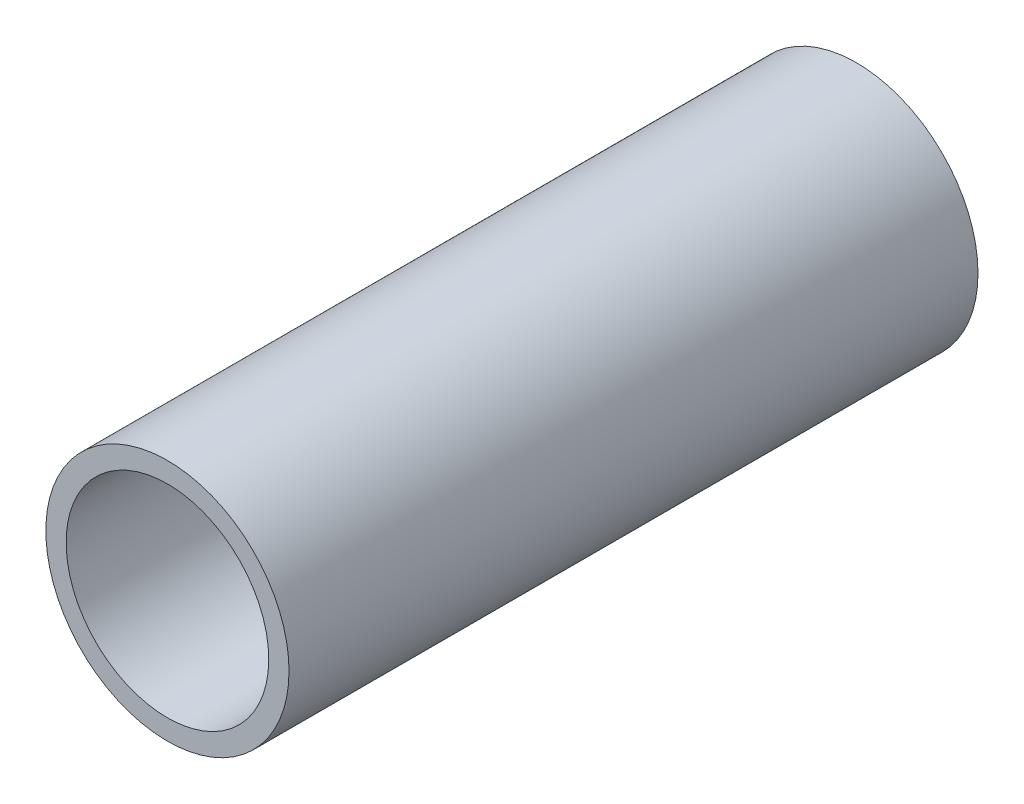
ISO-10303-21;
HEADER;
FILE_DESCRIPTION(('STEP AP214'),'2;1');
FILE_NAME('part.step','',(''),(''),'','','');
FILE_SCHEMA(('AUTOMOTIVE_DESIGN { 1 0 10303 214 1 1 1 1 }'));
ENDSEC;
DATA;
#1=APPLICATION_CONTEXT('core data for automotive mechanical design processes');
#2=APPLICATION_PROTOCOL_DEFINITION('international standard','automotive_design',2000,#1);
#3=PRODUCT_CONTEXT('',#1,'mechanical');
#4=PRODUCT('Part','Part','',(#3));
#5=PRODUCT_RELATED_PRODUCT_CATEGORY('part','',(#4));
#6=PRODUCT_DEFINITION_FORMATION('','',#4);
#7=PRODUCT_DEFINITION_CONTEXT('part definition',#1,'design');
#8=PRODUCT_DEFINITION('design','',#6,#7);
#9=PRODUCT_DEFINITION_SHAPE('','',#8);
#10=(LENGTH_UNIT() NAMED_UNIT(*) SI_UNIT(.MILLI.,.METRE.));
#11=(NAMED_UNIT(*) PLANE_ANGLE_UNIT() SI_UNIT($,.RADIAN.));
#12=(NAMED_UNIT(*) SI_UNIT($,.STERADIAN.) SOLID_ANGLE_UNIT());
#13=UNCERTAINTY_MEASURE_WITH_UNIT(LENGTH_MEASURE(1.E-05),#10,'distance_accuracy_value','');
#14=(GEOMETRIC_REPRESENTATION_CONTEXT(3) GLOBAL_UNCERTAINTY_ASSIGNED_CONTEXT((#13)) GLOBAL_UNIT_ASSIGNED_CONTEXT((#10,
#11,#12)) REPRESENTATION_CONTEXT('',''));
#15=CARTESIAN_POINT('',(0.,0.,0.));
#16=DIRECTION('',(0.,0.,1.));
#17=DIRECTION('',(1.,0.,0.));
#18=AXIS2_PLACEMENT_3D('',#15,#16,#17);
#19=CARTESIAN_POINT('',(-1.8328597873269,11.125,-51.));
#20=DIRECTION('',(0.,0.,1.));
#21=DIRECTION('',(1.,0.,0.));
#22=AXIS2_PLACEMENT_3D('',#19,#20,#21);
#23=PLANE('',#22);
#24=CARTESIAN_POINT('',(0.,0.,-51.));
#25=DIRECTION('',(0.,0.,1.));
#26=DIRECTION('',(1.,0.,0.));
#27=AXIS2_PLACEMENT_3D('',#24,#25,#26);
#28=CIRCLE('',#27,7.5);
#29=CARTESIAN_POINT('',(7.5,0.,-51.));
#30=VERTEX_POINT('',#29);
#31=EDGE_CURVE('E11',#30,#30,#28,.F.);
#32=ORIENTED_EDGE('',*,*,#31,.F.);
#33=EDGE_LOOP('',(#32));
#34=FACE_BOUND('',#33,.T.);
#35=CARTESIAN_POINT('',(0.,0.,-51.));
#36=DIRECTION('',(0.,0.,1.));
#37=DIRECTION('',(1.,0.,0.));
#38=AXIS2_PLACEMENT_3D('',#35,#36,#37);
#39=CIRCLE('',#38,9.);
#40=CARTESIAN_POINT('',(9.,0.,-51.));
#41=VERTEX_POINT('',#40);
#42=EDGE_CURVE('E44',#41,#41,#39,.T.);
#43=ORIENTED_EDGE('',*,*,#42,.F.);
#44=EDGE_LOOP('',(#43));
#45=FACE_BOUND('',#44,.T.);
#46=ADVANCED_FACE('F34',(#34,#45),#23,.F.);
#47=CARTESIAN_POINT('',(0.,0.,0.));
#48=DIRECTION('',(0.,0.,1.));
#49=DIRECTION('',(1.,0.,0.));
#50=AXIS2_PLACEMENT_3D('',#47,#48,#49);
#51=PLANE('',#50);
#52=CARTESIAN_POINT('',(0.,0.,0.));
#53=DIRECTION('',(0.,0.,1.));
#54=DIRECTION('',(1.,0.,0.));
#55=AXIS2_PLACEMENT_3D('',#52,#53,#54);
#56=CIRCLE('',#55,7.5);
#57=CARTESIAN_POINT('',(7.5,0.,0.));
#58=VERTEX_POINT('',#57);
#59=EDGE_CURVE('E40',#58,#58,#56,.T.);
#60=ORIENTED_EDGE('',*,*,#59,.F.);
#61=EDGE_LOOP('',(#60));
#62=FACE_BOUND('',#61,.T.);
#63=CARTESIAN_POINT('',(0.,0.,0.));
#64=DIRECTION('',(0.,0.,1.));
#65=DIRECTION('',(1.,0.,0.));
#66=AXIS2_PLACEMENT_3D('',#63,#64,#65);
#67=CIRCLE('',#66,9.);
#68=CARTESIAN_POINT('',(9.,0.,0.));
#69=VERTEX_POINT('',#68);
#70=EDGE_CURVE('E48',#69,#69,#67,.T.);
#71=ORIENTED_EDGE('',*,*,#70,.T.);
#72=EDGE_LOOP('',(#71));
#73=FACE_BOUND('',#72,.T.);
#74=ADVANCED_FACE('F54',(#62,#73),#51,.T.);
#75=CARTESIAN_POINT('',(0.,0.,-57.));
#76=DIRECTION('',(0.,0.,1.));
#77=DIRECTION('',(1.,0.,0.));
#78=AXIS2_PLACEMENT_3D('',#75,#76,#77);
#79=CYLINDRICAL_SURFACE('',#78,7.5);
#80=CARTESIAN_POINT('',(7.5,0.,-51.));
#81=CARTESIAN_POINT('',(7.5,0.,-50.46875));
#82=CARTESIAN_POINT('',(7.5,0.,-49.9375));
#83=CARTESIAN_POINT('',(7.5,0.,-48.875));
#84=CARTESIAN_POINT('',(7.5,0.,-48.34375));
#85=CARTESIAN_POINT('',(7.5,0.,-47.28125));
#86=CARTESIAN_POINT('',(7.5,0.,-46.75));
#87=CARTESIAN_POINT('',(7.5,0.,-45.6875));
#88=CARTESIAN_POINT('',(7.5,0.,-45.15625));
#89=CARTESIAN_POINT('',(7.5,0.,-44.09375));
#90=CARTESIAN_POINT('',(7.5,0.,-43.5625));
#91=CARTESIAN_POINT('',(7.5,0.,-42.5));
#92=CARTESIAN_POINT('',(7.5,0.,-41.96875));
#93=CARTESIAN_POINT('',(7.5,0.,-40.90625));
#94=CARTESIAN_POINT('',(7.5,0.,-40.375));
#95=CARTESIAN_POINT('',(7.5,0.,-39.3125));
#96=CARTESIAN_POINT('',(7.5,0.,-38.78125));
#97=CARTESIAN_POINT('',(7.5,0.,-37.71875));
#98=CARTESIAN_POINT('',(7.5,0.,-37.1875));
#99=CARTESIAN_POINT('',(7.5,0.,-36.125));
#100=CARTESIAN_POINT('',(7.5,0.,-35.59375));
#101=CARTESIAN_POINT('',(7.5,0.,-34.53125));
#102=CARTESIAN_POINT('',(7.5,0.,-34.));
#103=CARTESIAN_POINT('',(7.5,0.,-32.9375));
#104=CARTESIAN_POINT('',(7.5,0.,-32.40625));
#105=CARTESIAN_POINT('',(7.5,0.,-31.34375));
#106=CARTESIAN_POINT('',(7.5,0.,-30.8125));
#107=CARTESIAN_POINT('',(7.5,0.,-29.75));
#108=CARTESIAN_POINT('',(7.5,0.,-29.21875));
#109=CARTESIAN_POINT('',(7.5,0.,-28.15625));
#110=CARTESIAN_POINT('',(7.5,0.,-27.625));
#111=CARTESIAN_POINT('',(7.5,0.,-26.5625));
#112=CARTESIAN_POINT('',(7.5,0.,-26.03125));
#113=CARTESIAN_POINT('',(7.5,0.,-24.96875));
#114=CARTESIAN_POINT('',(7.5,0.,-24.4375));
#115=CARTESIAN_POINT('',(7.5,0.,-23.375));
#116=CARTESIAN_POINT('',(7.5,0.,-22.84375));
#117=CARTESIAN_POINT('',(7.5,0.,-21.78125));
#118=CARTESIAN_POINT('',(7.5,0.,-21.25));
#119=CARTESIAN_POINT('',(7.5,0.,-20.1875));
#120=CARTESIAN_POINT('',(7.5,0.,-19.65625));
#121=CARTESIAN_POINT('',(7.5,0.,-18.59375));
#122=CARTESIAN_POINT('',(7.5,0.,-18.0625));
#123=CARTESIAN_POINT('',(7.5,0.,-17.));
#124=CARTESIAN_POINT('',(7.5,0.,-16.46875));
#125=CARTESIAN_POINT('',(7.5,0.,-15.40625));
#126=CARTESIAN_POINT('',(7.5,0.,-14.875));
#127=CARTESIAN_POINT('',(7.5,0.,-13.8125));
#128=CARTESIAN_POINT('',(7.5,0.,-13.28125));
#129=CARTESIAN_POINT('',(7.5,0.,-12.21875));
#130=CARTESIAN_POINT('',(7.5,0.,-11.6875));
#131=CARTESIAN_POINT('',(7.5,0.,-10.625));
#132=CARTESIAN_POINT('',(7.5,0.,-10.09375));
#133=CARTESIAN_POINT('',(7.5,0.,-9.03125));
#134=CARTESIAN_POINT('',(7.5,0.,-8.5));
#135=CARTESIAN_POINT('',(7.5,0.,-7.4375));
#136=CARTESIAN_POINT('',(7.5,0.,-6.90625));
#137=CARTESIAN_POINT('',(7.5,0.,-5.84375));
#138=CARTESIAN_POINT('',(7.5,0.,-5.3125));
#139=CARTESIAN_POINT('',(7.5,0.,-4.25));
#140=CARTESIAN_POINT('',(7.5,0.,-3.71875));
#141=CARTESIAN_POINT('',(7.5,0.,-2.65624999999999));
#142=CARTESIAN_POINT('',(7.5,0.,-2.12499999999999));
#143=CARTESIAN_POINT('',(7.5,0.,-1.06249999999999));
#144=CARTESIAN_POINT('',(7.5,0.,-0.531249999999998));
#145=CARTESIAN_POINT('',(7.5,0.,0.));
#146=B_SPLINE_CURVE_WITH_KNOTS('',3,(#80,#81,#82,#83,#84,#85,#86,#87,#88,#89,#90,#91,#92,#93,
#94,#95,#96,#97,#98,#99,#100,#101,#102,#103,#104,#105,#106,#107,#108,#109,#110,#111,#112,#113,
#114,#115,#116,#117,#118,#119,#120,#121,#122,#123,#124,#125,#126,#127,#128,#129,#130,#131,#132,
#133,#134,#135,#136,#137,#138,#139,#140,#141,#142,#143,#144,#145),.UNSPECIFIED.,.F.,.F.,(4,2,2,
2,2,2,2,2,2,2,2,2,2,2,2,2,2,2,2,2,2,2,2,2,2,2,2,2,2,2,2,2,4),(0.,1.59375,3.1875,4.78125,
6.37500000000001,7.96875,9.56250000000001,11.15625,12.75,14.34375,15.9375,17.53125,19.125,
20.71875,22.3125,23.90625,25.5,27.09375,28.6875,30.28125,31.875,33.46875,35.0625,36.65625,38.25,
39.84375,41.4375,43.03125,44.625,46.21875,47.8125,49.40625,51.),.UNSPECIFIED.);
#147=EDGE_CURVE('BSEAM58',#30,#58,#146,.T.);
#148=ORIENTED_EDGE('',*,*,#31,.T.);
#149=ORIENTED_EDGE('',*,*,#59,.T.);
#150=ORIENTED_EDGE('',*,*,#147,.T.);
#151=ORIENTED_EDGE('',*,*,#147,.F.);
#152=EDGE_LOOP('',(#148,#150,#149,#151));
#153=FACE_BOUND('',#152,.T.);
#154=ADVANCED_FACE('F58',(#153),#79,.F.);
#155=CARTESIAN_POINT('',(0.,0.,-51.));
#156=DIRECTION('',(0.,0.,1.));
#157=DIRECTION('',(1.,0.,0.));
#158=AXIS2_PLACEMENT_3D('',#155,#156,#157);
#159=CYLINDRICAL_SURFACE('',#158,9.);
#160=ORIENTED_EDGE('',*,*,#42,.T.);
#161=EDGE_LOOP('',(#160));
#162=FACE_BOUND('',#161,.T.);
#163=ORIENTED_EDGE('',*,*,#70,.F.);
#164=EDGE_LOOP('',(#163));
#165=FACE_BOUND('',#164,.T.);
#166=ADVANCED_FACE('F56',(#162,#165),#159,.T.);
#167=CLOSED_SHELL('',(#46,#74,#154,#166));
#168=MANIFOLD_SOLID_BREP('B2',#167);
#169=ADVANCED_BREP_SHAPE_REPRESENTATION('',(#18,#168),#14);
#170=SHAPE_DEFINITION_REPRESENTATION(#9,#169);
ENDSEC;
END-ISO-10303-21;
